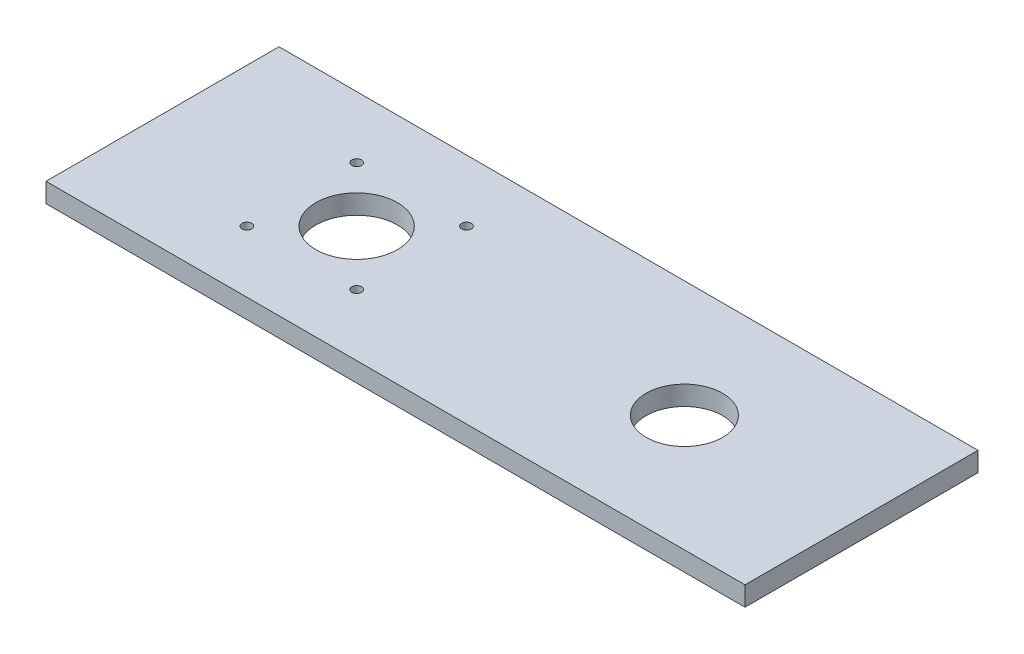
ISO-10303-21;
HEADER;
FILE_DESCRIPTION(('STEP AP214'),'2;1');
FILE_NAME('part.step','',(''),(''),'','','');
FILE_SCHEMA(('AUTOMOTIVE_DESIGN { 1 0 10303 214 1 1 1 1 }'));
ENDSEC;
DATA;
#1=APPLICATION_CONTEXT('core data for automotive mechanical design processes');
#2=APPLICATION_PROTOCOL_DEFINITION('international standard','automotive_design',2000,#1);
#3=PRODUCT_CONTEXT('',#1,'mechanical');
#4=PRODUCT('Part','Part','',(#3));
#5=PRODUCT_RELATED_PRODUCT_CATEGORY('part','',(#4));
#6=PRODUCT_DEFINITION_FORMATION('','',#4);
#7=PRODUCT_DEFINITION_CONTEXT('part definition',#1,'design');
#8=PRODUCT_DEFINITION('design','',#6,#7);
#9=PRODUCT_DEFINITION_SHAPE('','',#8);
#10=(LENGTH_UNIT() NAMED_UNIT(*) SI_UNIT(.MILLI.,.METRE.));
#11=(NAMED_UNIT(*) PLANE_ANGLE_UNIT() SI_UNIT($,.RADIAN.));
#12=(NAMED_UNIT(*) SI_UNIT($,.STERADIAN.) SOLID_ANGLE_UNIT());
#13=UNCERTAINTY_MEASURE_WITH_UNIT(LENGTH_MEASURE(1.E-05),#10,'distance_accuracy_value','');
#14=(GEOMETRIC_REPRESENTATION_CONTEXT(3) GLOBAL_UNCERTAINTY_ASSIGNED_CONTEXT((#13)) GLOBAL_UNIT_ASSIGNED_CONTEXT((#10,
#11,#12)) REPRESENTATION_CONTEXT('',''));
#15=CARTESIAN_POINT('',(0.,0.,0.));
#16=DIRECTION('',(0.,0.,1.));
#17=DIRECTION('',(1.,0.,0.));
#18=AXIS2_PLACEMENT_3D('',#15,#16,#17);
#19=CARTESIAN_POINT('',(0.,5.,0.));
#20=DIRECTION('',(0.,1.,0.));
#21=DIRECTION('',(0.,0.,1.));
#22=AXIS2_PLACEMENT_3D('',#19,#20,#21);
#23=PLANE('',#22);
#24=CARTESIAN_POINT('',(-14.1421356237309,5.,-14.142135623731));
#25=DIRECTION('',(0.,1.,0.));
#26=DIRECTION('',(0.,0.,1.));
#27=AXIS2_PLACEMENT_3D('',#24,#25,#26);
#28=CIRCLE('',#27,1.24999999999999);
#29=CARTESIAN_POINT('',(-14.1421356237309,5.,-12.892135623731));
#30=VERTEX_POINT('',#29);
#31=EDGE_CURVE('E151',#30,#30,#28,.T.);
#32=ORIENTED_EDGE('',*,*,#31,.F.);
#33=EDGE_LOOP('',(#32));
#34=FACE_BOUND('',#33,.T.);
#35=CARTESIAN_POINT('',(14.142135623731,5.,-14.1421356237317));
#36=DIRECTION('',(0.,1.,0.));
#37=DIRECTION('',(0.,0.,1.));
#38=AXIS2_PLACEMENT_3D('',#35,#36,#37);
#39=CIRCLE('',#38,1.24999999999999);
#40=CARTESIAN_POINT('',(14.142135623731,5.,-12.8921356237317));
#41=VERTEX_POINT('',#40);
#42=EDGE_CURVE('E145',#41,#41,#39,.T.);
#43=ORIENTED_EDGE('',*,*,#42,.F.);
#44=EDGE_LOOP('',(#43));
#45=FACE_BOUND('',#44,.T.);
#46=CARTESIAN_POINT('',(14.1421356237317,5.,14.1421356237302));
#47=DIRECTION('',(0.,1.,0.));
#48=DIRECTION('',(0.,0.,1.));
#49=AXIS2_PLACEMENT_3D('',#46,#47,#48);
#50=CIRCLE('',#49,1.24999999999999);
#51=CARTESIAN_POINT('',(14.1421356237317,5.,15.3921356237302));
#52=VERTEX_POINT('',#51);
#53=EDGE_CURVE('E139',#52,#52,#50,.T.);
#54=ORIENTED_EDGE('',*,*,#53,.F.);
#55=EDGE_LOOP('',(#54));
#56=FACE_BOUND('',#55,.T.);
#57=CARTESIAN_POINT('',(-14.1421356237302,5.,14.1421356237309));
#58=DIRECTION('',(0.,1.,0.));
#59=DIRECTION('',(0.,0.,1.));
#60=AXIS2_PLACEMENT_3D('',#57,#58,#59);
#61=CIRCLE('',#60,1.24999999999999);
#62=CARTESIAN_POINT('',(-14.1421356237302,5.,15.3921356237309));
#63=VERTEX_POINT('',#62);
#64=EDGE_CURVE('E133',#63,#63,#61,.T.);
#65=ORIENTED_EDGE('',*,*,#64,.F.);
#66=EDGE_LOOP('',(#65));
#67=FACE_BOUND('',#66,.T.);
#68=CARTESIAN_POINT('',(0.,5.,0.));
#69=DIRECTION('',(0.,1.,0.));
#70=DIRECTION('',(0.,0.,1.));
#71=AXIS2_PLACEMENT_3D('',#68,#69,#70);
#72=CIRCLE('',#71,10.5);
#73=CARTESIAN_POINT('',(0.,5.,10.5));
#74=VERTEX_POINT('',#73);
#75=EDGE_CURVE('E107',#74,#74,#72,.T.);
#76=ORIENTED_EDGE('',*,*,#75,.F.);
#77=EDGE_LOOP('',(#76));
#78=FACE_BOUND('',#77,.T.);
#79=DIRECTION('',(1.,0.,0.));
#80=VECTOR('',#79,1.);
#81=CARTESIAN_POINT('',(130.,5.,30.));
#82=LINE('',#81,#80);
#83=CARTESIAN_POINT('',(-50.,5.,30.));
#84=VERTEX_POINT('',#83);
#85=CARTESIAN_POINT('',(130.,5.,30.));
#86=VERTEX_POINT('',#85);
#87=EDGE_CURVE('E92',#84,#86,#82,.T.);
#88=ORIENTED_EDGE('',*,*,#87,.T.);
#89=DIRECTION('',(0.,0.,-1.));
#90=VECTOR('',#89,1.);
#91=CARTESIAN_POINT('',(130.,5.,-30.));
#92=LINE('',#91,#90);
#93=CARTESIAN_POINT('',(130.,5.,-30.));
#94=VERTEX_POINT('',#93);
#95=EDGE_CURVE('E87',#86,#94,#92,.T.);
#96=ORIENTED_EDGE('',*,*,#95,.T.);
#97=DIRECTION('',(-1.,0.,0.));
#98=VECTOR('',#97,1.);
#99=CARTESIAN_POINT('',(-50.,5.,-29.9999999999999));
#100=LINE('',#99,#98);
#101=CARTESIAN_POINT('',(-50.,5.,-29.9999999999999));
#102=VERTEX_POINT('',#101);
#103=EDGE_CURVE('E90',#94,#102,#100,.T.);
#104=ORIENTED_EDGE('',*,*,#103,.T.);
#105=DIRECTION('',(0.,0.,1.));
#106=VECTOR('',#105,1.);
#107=CARTESIAN_POINT('',(-50.,5.,-29.9999999999999));
#108=LINE('',#107,#106);
#109=EDGE_CURVE('E57',#102,#84,#108,.T.);
#110=ORIENTED_EDGE('',*,*,#109,.T.);
#111=EDGE_LOOP('',(#88,#96,#104,#110));
#112=FACE_BOUND('',#111,.T.);
#113=CARTESIAN_POINT('',(84.3856127895503,5.,0.));
#114=DIRECTION('',(0.,1.,0.));
#115=DIRECTION('',(0.,0.,1.));
#116=AXIS2_PLACEMENT_3D('',#113,#114,#115);
#117=CIRCLE('',#116,9.84832084782724);
#118=CARTESIAN_POINT('',(84.3856127895503,5.,9.84832084782724));
#119=VERTEX_POINT('',#118);
#120=EDGE_CURVE('E122',#119,#119,#117,.T.);
#121=ORIENTED_EDGE('',*,*,#120,.F.);
#122=EDGE_LOOP('',(#121));
#123=FACE_BOUND('',#122,.T.);
#124=ADVANCED_FACE('F40',(#34,#45,#56,#67,#78,#112,#123),#23,.T.);
#125=CARTESIAN_POINT('',(0.,0.,0.));
#126=DIRECTION('',(0.,1.,0.));
#127=DIRECTION('',(0.,0.,1.));
#128=AXIS2_PLACEMENT_3D('',#125,#126,#127);
#129=PLANE('',#128);
#130=CARTESIAN_POINT('',(-14.1421356237309,0.,-14.142135623731));
#131=DIRECTION('',(0.,1.,0.));
#132=DIRECTION('',(0.,0.,1.));
#133=AXIS2_PLACEMENT_3D('',#130,#131,#132);
#134=CIRCLE('',#133,1.25);
#135=CARTESIAN_POINT('',(-14.1421356237309,0.,-12.892135623731));
#136=VERTEX_POINT('',#135);
#137=EDGE_CURVE('E148',#136,#136,#134,.T.);
#138=ORIENTED_EDGE('',*,*,#137,.T.);
#139=EDGE_LOOP('',(#138));
#140=FACE_BOUND('',#139,.T.);
#141=CARTESIAN_POINT('',(14.142135623731,0.,-14.1421356237317));
#142=DIRECTION('',(0.,1.,0.));
#143=DIRECTION('',(0.,0.,1.));
#144=AXIS2_PLACEMENT_3D('',#141,#142,#143);
#145=CIRCLE('',#144,1.25);
#146=CARTESIAN_POINT('',(14.142135623731,0.,-12.8921356237317));
#147=VERTEX_POINT('',#146);
#148=EDGE_CURVE('E142',#147,#147,#145,.T.);
#149=ORIENTED_EDGE('',*,*,#148,.T.);
#150=EDGE_LOOP('',(#149));
#151=FACE_BOUND('',#150,.T.);
#152=CARTESIAN_POINT('',(14.1421356237317,0.,14.1421356237302));
#153=DIRECTION('',(0.,1.,0.));
#154=DIRECTION('',(0.,0.,1.));
#155=AXIS2_PLACEMENT_3D('',#152,#153,#154);
#156=CIRCLE('',#155,1.25);
#157=CARTESIAN_POINT('',(14.1421356237317,0.,15.3921356237302));
#158=VERTEX_POINT('',#157);
#159=EDGE_CURVE('E136',#158,#158,#156,.T.);
#160=ORIENTED_EDGE('',*,*,#159,.T.);
#161=EDGE_LOOP('',(#160));
#162=FACE_BOUND('',#161,.T.);
#163=CARTESIAN_POINT('',(-14.1421356237302,0.,14.1421356237309));
#164=DIRECTION('',(0.,1.,0.));
#165=DIRECTION('',(0.,0.,1.));
#166=AXIS2_PLACEMENT_3D('',#163,#164,#165);
#167=CIRCLE('',#166,1.25);
#168=CARTESIAN_POINT('',(-14.1421356237302,0.,15.3921356237309));
#169=VERTEX_POINT('',#168);
#170=EDGE_CURVE('E128',#169,#169,#167,.T.);
#171=ORIENTED_EDGE('',*,*,#170,.T.);
#172=EDGE_LOOP('',(#171));
#173=FACE_BOUND('',#172,.T.);
#174=DIRECTION('',(1.,0.,0.));
#175=VECTOR('',#174,1.);
#176=CARTESIAN_POINT('',(130.,0.,30.));
#177=LINE('',#176,#175);
#178=CARTESIAN_POINT('',(-50.,0.,30.));
#179=VERTEX_POINT('',#178);
#180=CARTESIAN_POINT('',(130.,0.,30.));
#181=VERTEX_POINT('',#180);
#182=EDGE_CURVE('E104',#179,#181,#177,.T.);
#183=ORIENTED_EDGE('',*,*,#182,.F.);
#184=DIRECTION('',(0.,0.,1.));
#185=VECTOR('',#184,1.);
#186=CARTESIAN_POINT('',(-50.,0.,-29.9999999999999));
#187=LINE('',#186,#185);
#188=CARTESIAN_POINT('',(-50.,0.,-29.9999999999999));
#189=VERTEX_POINT('',#188);
#190=EDGE_CURVE('E80',#189,#179,#187,.T.);
#191=ORIENTED_EDGE('',*,*,#190,.F.);
#192=DIRECTION('',(-1.,0.,0.));
#193=VECTOR('',#192,1.);
#194=CARTESIAN_POINT('',(-50.,0.,-29.9999999999999));
#195=LINE('',#194,#193);
#196=CARTESIAN_POINT('',(130.,0.,-30.));
#197=VERTEX_POINT('',#196);
#198=EDGE_CURVE('E74',#197,#189,#195,.T.);
#199=ORIENTED_EDGE('',*,*,#198,.F.);
#200=DIRECTION('',(0.,0.,-1.));
#201=VECTOR('',#200,1.);
#202=CARTESIAN_POINT('',(130.,0.,-30.));
#203=LINE('',#202,#201);
#204=EDGE_CURVE('E96',#181,#197,#203,.T.);
#205=ORIENTED_EDGE('',*,*,#204,.F.);
#206=EDGE_LOOP('',(#183,#191,#199,#205));
#207=FACE_BOUND('',#206,.T.);
#208=CARTESIAN_POINT('',(0.,0.,0.));
#209=DIRECTION('',(0.,1.,0.));
#210=DIRECTION('',(0.,0.,1.));
#211=AXIS2_PLACEMENT_3D('',#208,#209,#210);
#212=CIRCLE('',#211,10.5);
#213=CARTESIAN_POINT('',(0.,0.,10.5));
#214=VERTEX_POINT('',#213);
#215=EDGE_CURVE('E119',#214,#214,#212,.T.);
#216=ORIENTED_EDGE('',*,*,#215,.T.);
#217=EDGE_LOOP('',(#216));
#218=FACE_BOUND('',#217,.T.);
#219=CARTESIAN_POINT('',(84.3856127895503,0.,0.));
#220=DIRECTION('',(0.,1.,0.));
#221=DIRECTION('',(0.,0.,1.));
#222=AXIS2_PLACEMENT_3D('',#219,#220,#221);
#223=CIRCLE('',#222,9.84832084782724);
#224=CARTESIAN_POINT('',(84.3856127895503,0.,9.84832084782724));
#225=VERTEX_POINT('',#224);
#226=EDGE_CURVE('E125',#225,#225,#223,.T.);
#227=ORIENTED_EDGE('',*,*,#226,.T.);
#228=EDGE_LOOP('',(#227));
#229=FACE_BOUND('',#228,.T.);
#230=ADVANCED_FACE('F115',(#140,#151,#162,#173,#207,#218,#229),#129,.F.);
#231=CARTESIAN_POINT('',(130.,5.,30.));
#232=DIRECTION('',(0.,0.,-1.));
#233=DIRECTION('',(-1.,0.,0.));
#234=AXIS2_PLACEMENT_3D('',#231,#232,#233);
#235=PLANE('',#234);
#236=ORIENTED_EDGE('',*,*,#182,.T.);
#237=DIRECTION('',(0.,-1.,0.));
#238=VECTOR('',#237,1.);
#239=CARTESIAN_POINT('',(130.,5.,30.));
#240=LINE('',#239,#238);
#241=EDGE_CURVE('E11',#86,#181,#240,.T.);
#242=ORIENTED_EDGE('',*,*,#241,.F.);
#243=ORIENTED_EDGE('',*,*,#87,.F.);
#244=DIRECTION('',(0.,-1.,0.));
#245=VECTOR('',#244,1.);
#246=CARTESIAN_POINT('',(-50.,5.,30.));
#247=LINE('',#246,#245);
#248=EDGE_CURVE('E100',#84,#179,#247,.T.);
#249=ORIENTED_EDGE('',*,*,#248,.T.);
#250=EDGE_LOOP('',(#236,#242,#243,#249));
#251=FACE_BOUND('',#250,.T.);
#252=ADVANCED_FACE('F42',(#251),#235,.F.);
#253=CARTESIAN_POINT('',(130.,5.,-30.));
#254=DIRECTION('',(-1.,0.,0.));
#255=DIRECTION('',(0.,0.,1.));
#256=AXIS2_PLACEMENT_3D('',#253,#254,#255);
#257=PLANE('',#256);
#258=ORIENTED_EDGE('',*,*,#204,.T.);
#259=DIRECTION('',(0.,-1.,0.));
#260=VECTOR('',#259,1.);
#261=CARTESIAN_POINT('',(130.,5.,-30.));
#262=LINE('',#261,#260);
#263=EDGE_CURVE('E49',#94,#197,#262,.T.);
#264=ORIENTED_EDGE('',*,*,#263,.F.);
#265=ORIENTED_EDGE('',*,*,#95,.F.);
#266=ORIENTED_EDGE('',*,*,#241,.T.);
#267=EDGE_LOOP('',(#258,#264,#265,#266));
#268=FACE_BOUND('',#267,.T.);
#269=ADVANCED_FACE('F95',(#268),#257,.F.);
#270=CARTESIAN_POINT('',(-50.,5.,-29.9999999999999));
#271=DIRECTION('',(0.,0.,1.));
#272=DIRECTION('',(1.,0.,0.));
#273=AXIS2_PLACEMENT_3D('',#270,#271,#272);
#274=PLANE('',#273);
#275=ORIENTED_EDGE('',*,*,#198,.T.);
#276=DIRECTION('',(0.,-1.,0.));
#277=VECTOR('',#276,1.);
#278=CARTESIAN_POINT('',(-50.,5.,-29.9999999999999));
#279=LINE('',#278,#277);
#280=EDGE_CURVE('E97',#102,#189,#279,.T.);
#281=ORIENTED_EDGE('',*,*,#280,.F.);
#282=ORIENTED_EDGE('',*,*,#103,.F.);
#283=ORIENTED_EDGE('',*,*,#263,.T.);
#284=EDGE_LOOP('',(#275,#281,#282,#283));
#285=FACE_BOUND('',#284,.T.);
#286=ADVANCED_FACE('F98',(#285),#274,.F.);
#287=CARTESIAN_POINT('',(-50.,5.,-29.9999999999999));
#288=DIRECTION('',(1.,0.,0.));
#289=DIRECTION('',(0.,0.,-1.));
#290=AXIS2_PLACEMENT_3D('',#287,#288,#289);
#291=PLANE('',#290);
#292=ORIENTED_EDGE('',*,*,#190,.T.);
#293=ORIENTED_EDGE('',*,*,#248,.F.);
#294=ORIENTED_EDGE('',*,*,#109,.F.);
#295=ORIENTED_EDGE('',*,*,#280,.T.);
#296=EDGE_LOOP('',(#292,#293,#294,#295));
#297=FACE_BOUND('',#296,.T.);
#298=ADVANCED_FACE('F112',(#297),#291,.F.);
#299=CARTESIAN_POINT('',(0.,5.,0.));
#300=DIRECTION('',(0.,-1.,0.));
#301=DIRECTION('',(0.,0.,-1.));
#302=AXIS2_PLACEMENT_3D('',#299,#300,#301);
#303=CYLINDRICAL_SURFACE('',#302,10.5);
#304=ORIENTED_EDGE('',*,*,#75,.T.);
#305=EDGE_LOOP('',(#304));
#306=FACE_BOUND('',#305,.T.);
#307=ORIENTED_EDGE('',*,*,#215,.F.);
#308=EDGE_LOOP('',(#307));
#309=FACE_BOUND('',#308,.T.);
#310=ADVANCED_FACE('F168',(#306,#309),#303,.F.);
#311=CARTESIAN_POINT('',(84.3856127895503,5.,0.));
#312=DIRECTION('',(0.,-1.,0.));
#313=DIRECTION('',(0.,0.,-1.));
#314=AXIS2_PLACEMENT_3D('',#311,#312,#313);
#315=CYLINDRICAL_SURFACE('',#314,9.84832084782724);
#316=ORIENTED_EDGE('',*,*,#120,.T.);
#317=EDGE_LOOP('',(#316));
#318=FACE_BOUND('',#317,.T.);
#319=ORIENTED_EDGE('',*,*,#226,.F.);
#320=EDGE_LOOP('',(#319));
#321=FACE_BOUND('',#320,.T.);
#322=ADVANCED_FACE('F171',(#318,#321),#315,.F.);
#323=CARTESIAN_POINT('',(-14.1421356237302,5.,14.1421356237309));
#324=DIRECTION('',(0.,1.,0.));
#325=DIRECTION('',(0.,0.,1.));
#326=AXIS2_PLACEMENT_3D('',#323,#324,#325);
#327=CYLINDRICAL_SURFACE('',#326,1.24999999999999);
#328=ORIENTED_EDGE('',*,*,#170,.F.);
#329=EDGE_LOOP('',(#328));
#330=FACE_BOUND('',#329,.T.);
#331=ORIENTED_EDGE('',*,*,#64,.T.);
#332=EDGE_LOOP('',(#331));
#333=FACE_BOUND('',#332,.T.);
#334=ADVANCED_FACE('F181',(#330,#333),#327,.F.);
#335=CARTESIAN_POINT('',(14.1421356237317,5.,14.1421356237302));
#336=DIRECTION('',(0.,1.,0.));
#337=DIRECTION('',(0.,0.,1.));
#338=AXIS2_PLACEMENT_3D('',#335,#336,#337);
#339=CYLINDRICAL_SURFACE('',#338,1.24999999999999);
#340=ORIENTED_EDGE('',*,*,#159,.F.);
#341=EDGE_LOOP('',(#340));
#342=FACE_BOUND('',#341,.T.);
#343=ORIENTED_EDGE('',*,*,#53,.T.);
#344=EDGE_LOOP('',(#343));
#345=FACE_BOUND('',#344,.T.);
#346=ADVANCED_FACE('F187',(#342,#345),#339,.F.);
#347=CARTESIAN_POINT('',(14.142135623731,5.,-14.1421356237317));
#348=DIRECTION('',(0.,1.,0.));
#349=DIRECTION('',(0.,0.,1.));
#350=AXIS2_PLACEMENT_3D('',#347,#348,#349);
#351=CYLINDRICAL_SURFACE('',#350,1.24999999999999);
#352=ORIENTED_EDGE('',*,*,#148,.F.);
#353=EDGE_LOOP('',(#352));
#354=FACE_BOUND('',#353,.T.);
#355=ORIENTED_EDGE('',*,*,#42,.T.);
#356=EDGE_LOOP('',(#355));
#357=FACE_BOUND('',#356,.T.);
#358=ADVANCED_FACE('F220',(#354,#357),#351,.F.);
#359=CARTESIAN_POINT('',(-14.1421356237309,5.,-14.142135623731));
#360=DIRECTION('',(0.,1.,0.));
#361=DIRECTION('',(0.,0.,1.));
#362=AXIS2_PLACEMENT_3D('',#359,#360,#361);
#363=CYLINDRICAL_SURFACE('',#362,1.24999999999999);
#364=ORIENTED_EDGE('',*,*,#137,.F.);
#365=EDGE_LOOP('',(#364));
#366=FACE_BOUND('',#365,.T.);
#367=ORIENTED_EDGE('',*,*,#31,.T.);
#368=EDGE_LOOP('',(#367));
#369=FACE_BOUND('',#368,.T.);
#370=ADVANCED_FACE('F155',(#366,#369),#363,.F.);
#371=CLOSED_SHELL('',(#124,#230,#252,#269,#286,#298,#310,#322,#334,#346,#358,#370));
#372=MANIFOLD_SOLID_BREP('B2',#371);
#373=ADVANCED_BREP_SHAPE_REPRESENTATION('',(#18,#372),#14);
#374=SHAPE_DEFINITION_REPRESENTATION(#9,#373);
ENDSEC;
END-ISO-10303-21;
